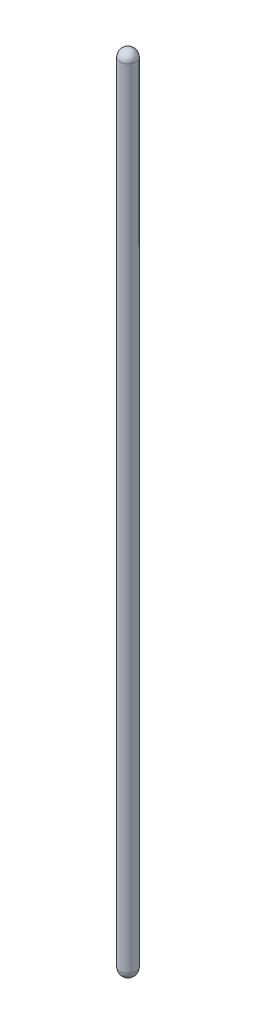
ISO-10303-21;
HEADER;
FILE_DESCRIPTION(('STEP AP214'),'2;1');
FILE_NAME('part.step','',(''),(''),'','','');
FILE_SCHEMA(('AUTOMOTIVE_DESIGN { 1 0 10303 214 1 1 1 1 }'));
ENDSEC;
DATA;
#1=APPLICATION_CONTEXT('core data for automotive mechanical design processes');
#2=APPLICATION_PROTOCOL_DEFINITION('international standard','automotive_design',2000,#1);
#3=PRODUCT_CONTEXT('',#1,'mechanical');
#4=PRODUCT('Part','Part','',(#3));
#5=PRODUCT_RELATED_PRODUCT_CATEGORY('part','',(#4));
#6=PRODUCT_DEFINITION_FORMATION('','',#4);
#7=PRODUCT_DEFINITION_CONTEXT('part definition',#1,'design');
#8=PRODUCT_DEFINITION('design','',#6,#7);
#9=PRODUCT_DEFINITION_SHAPE('','',#8);
#10=(LENGTH_UNIT() NAMED_UNIT(*) SI_UNIT(.MILLI.,.METRE.));
#11=(NAMED_UNIT(*) PLANE_ANGLE_UNIT() SI_UNIT($,.RADIAN.));
#12=(NAMED_UNIT(*) SI_UNIT($,.STERADIAN.) SOLID_ANGLE_UNIT());
#13=UNCERTAINTY_MEASURE_WITH_UNIT(LENGTH_MEASURE(1.E-05),#10,'distance_accuracy_value','');
#14=(GEOMETRIC_REPRESENTATION_CONTEXT(3) GLOBAL_UNCERTAINTY_ASSIGNED_CONTEXT((#13)) GLOBAL_UNIT_ASSIGNED_CONTEXT((#10,
#11,#12)) REPRESENTATION_CONTEXT('',''));
#15=CARTESIAN_POINT('',(0.,0.,0.));
#16=DIRECTION('',(0.,0.,1.));
#17=DIRECTION('',(1.,0.,0.));
#18=AXIS2_PLACEMENT_3D('',#15,#16,#17);
#19=CARTESIAN_POINT('',(0.,500.,0.));
#20=DIRECTION('',(0.,-1.,0.));
#21=DIRECTION('',(0.,0.,-1.));
#22=AXIS2_PLACEMENT_3D('',#19,#20,#21);
#23=CYLINDRICAL_SURFACE('',#22,5.);
#24=CARTESIAN_POINT('',(0.,5.,0.));
#25=DIRECTION('',(0.,-1.,0.));
#26=DIRECTION('',(0.,0.,-1.));
#27=AXIS2_PLACEMENT_3D('',#24,#25,#26);
#28=CIRCLE('',#27,5.);
#29=CARTESIAN_POINT('',(0.,5.,-5.));
#30=VERTEX_POINT('',#29);
#31=EDGE_CURVE('E10',#30,#30,#28,.F.);
#32=ORIENTED_EDGE('',*,*,#31,.T.);
#33=EDGE_LOOP('',(#32));
#34=FACE_BOUND('',#33,.T.);
#35=CARTESIAN_POINT('',(0.,495.,0.));
#36=DIRECTION('',(0.,-1.,0.));
#37=DIRECTION('',(0.,0.,-1.));
#38=AXIS2_PLACEMENT_3D('',#35,#36,#37);
#39=CIRCLE('',#38,5.);
#40=CARTESIAN_POINT('',(0.,495.,-5.));
#41=VERTEX_POINT('',#40);
#42=EDGE_CURVE('E57',#41,#41,#39,.T.);
#43=ORIENTED_EDGE('',*,*,#42,.T.);
#44=EDGE_LOOP('',(#43));
#45=FACE_BOUND('',#44,.T.);
#46=ADVANCED_FACE('F49',(#34,#45),#23,.T.);
#47=CARTESIAN_POINT('',(0.,5.,0.));
#48=DIRECTION('',(0.,1.,0.));
#49=DIRECTION('',(0.,0.,1.));
#50=AXIS2_PLACEMENT_3D('',#47,#48,#49);
#51=SPHERICAL_SURFACE('',#50,5.);
#52=ORIENTED_EDGE('',*,*,#31,.F.);
#53=EDGE_LOOP('',(#52));
#54=FACE_BOUND('',#53,.T.);
#55=ADVANCED_FACE('F66',(#54),#51,.T.);
#56=CARTESIAN_POINT('',(0.,495.,0.));
#57=DIRECTION('',(0.,1.,0.));
#58=DIRECTION('',(0.,0.,1.));
#59=AXIS2_PLACEMENT_3D('',#56,#57,#58);
#60=SPHERICAL_SURFACE('',#59,5.);
#61=ORIENTED_EDGE('',*,*,#42,.F.);
#62=EDGE_LOOP('',(#61));
#63=FACE_BOUND('',#62,.T.);
#64=ADVANCED_FACE('F51',(#63),#60,.T.);
#65=CLOSED_SHELL('',(#46,#55,#64));
#66=MANIFOLD_SOLID_BREP('B2',#65);
#67=ADVANCED_BREP_SHAPE_REPRESENTATION('',(#18,#66),#14);
#68=SHAPE_DEFINITION_REPRESENTATION(#9,#67);
ENDSEC;
END-ISO-10303-21;
